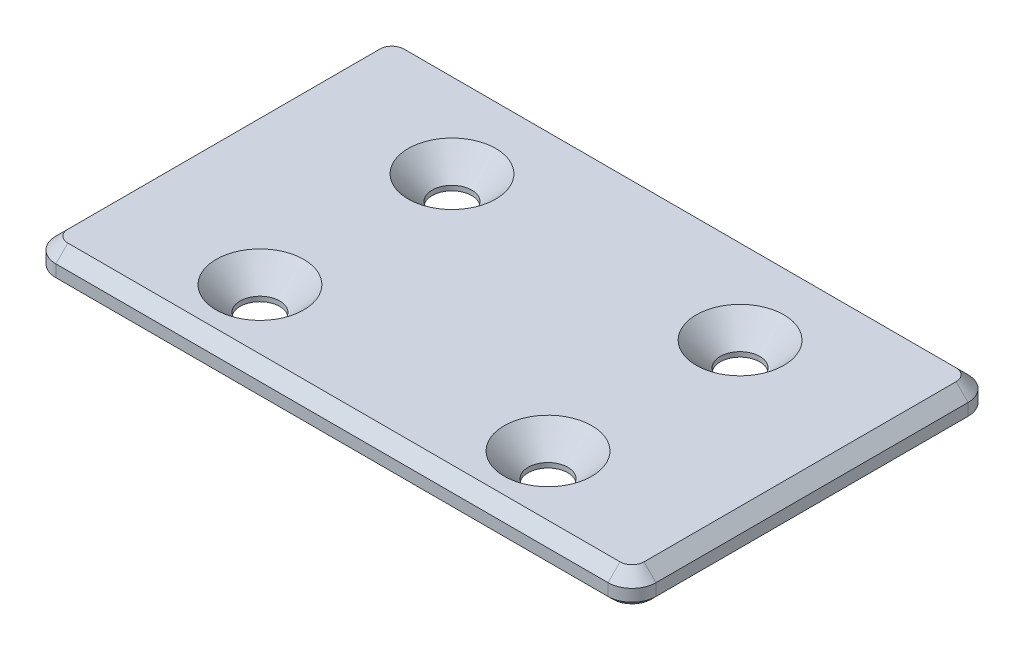
ISO-10303-21;
HEADER;
FILE_DESCRIPTION(('STEP AP214'),'2;1');
FILE_NAME('part.step','',(''),(''),'','','');
FILE_SCHEMA(('AUTOMOTIVE_DESIGN { 1 0 10303 214 1 1 1 1 }'));
ENDSEC;
DATA;
#1=APPLICATION_CONTEXT('core data for automotive mechanical design processes');
#2=APPLICATION_PROTOCOL_DEFINITION('international standard','automotive_design',2000,#1);
#3=PRODUCT_CONTEXT('',#1,'mechanical');
#4=PRODUCT('Part','Part','',(#3));
#5=PRODUCT_RELATED_PRODUCT_CATEGORY('part','',(#4));
#6=PRODUCT_DEFINITION_FORMATION('','',#4);
#7=PRODUCT_DEFINITION_CONTEXT('part definition',#1,'design');
#8=PRODUCT_DEFINITION('design','',#6,#7);
#9=PRODUCT_DEFINITION_SHAPE('','',#8);
#10=(LENGTH_UNIT() NAMED_UNIT(*) SI_UNIT(.MILLI.,.METRE.));
#11=(NAMED_UNIT(*) PLANE_ANGLE_UNIT() SI_UNIT($,.RADIAN.));
#12=(NAMED_UNIT(*) SI_UNIT($,.STERADIAN.) SOLID_ANGLE_UNIT());
#13=UNCERTAINTY_MEASURE_WITH_UNIT(LENGTH_MEASURE(1.E-05),#10,'distance_accuracy_value','');
#14=(GEOMETRIC_REPRESENTATION_CONTEXT(3) GLOBAL_UNCERTAINTY_ASSIGNED_CONTEXT((#13)) GLOBAL_UNIT_ASSIGNED_CONTEXT((#10,
#11,#12)) REPRESENTATION_CONTEXT('',''));
#15=CARTESIAN_POINT('',(0.,0.,0.));
#16=DIRECTION('',(0.,0.,1.));
#17=DIRECTION('',(1.,0.,0.));
#18=AXIS2_PLACEMENT_3D('',#15,#16,#17);
#19=CARTESIAN_POINT('',(0.,2.4,0.));
#20=DIRECTION('',(1.,0.,0.));
#21=DIRECTION('',(0.,0.,-1.));
#22=AXIS2_PLACEMENT_3D('',#19,#20,#21);
#23=PLANE('',#22);
#24=DIRECTION('',(0.,-1.,0.));
#25=VECTOR('',#24,1.);
#26=CARTESIAN_POINT('',(0.,2.4,-28.));
#27=LINE('',#26,#25);
#28=CARTESIAN_POINT('',(0.,1.4,-28.));
#29=VERTEX_POINT('',#28);
#30=CARTESIAN_POINT('',(0.,0.400000000000005,-28.));
#31=VERTEX_POINT('',#30);
#32=EDGE_CURVE('E308',#29,#31,#27,.T.);
#33=ORIENTED_EDGE('',*,*,#32,.T.);
#34=DIRECTION('',(0.,0.,1.));
#35=VECTOR('',#34,1.);
#36=CARTESIAN_POINT('',(0.,0.400000000000005,-2.));
#37=LINE('',#36,#35);
#38=CARTESIAN_POINT('',(0.,0.400000000000005,-2.));
#39=VERTEX_POINT('',#38);
#40=EDGE_CURVE('E221',#31,#39,#37,.T.);
#41=ORIENTED_EDGE('',*,*,#40,.T.);
#42=DIRECTION('',(0.,-1.,0.));
#43=VECTOR('',#42,1.);
#44=CARTESIAN_POINT('',(0.,2.4,-2.));
#45=LINE('',#44,#43);
#46=CARTESIAN_POINT('',(0.,1.4,-2.));
#47=VERTEX_POINT('',#46);
#48=EDGE_CURVE('E180',#39,#47,#45,.F.);
#49=ORIENTED_EDGE('',*,*,#48,.T.);
#50=DIRECTION('',(0.,0.,-1.));
#51=VECTOR('',#50,1.);
#52=CARTESIAN_POINT('',(0.,1.4,0.));
#53=LINE('',#52,#51);
#54=EDGE_CURVE('E276',#47,#29,#53,.T.);
#55=ORIENTED_EDGE('',*,*,#54,.T.);
#56=EDGE_LOOP('',(#33,#41,#49,#55));
#57=FACE_BOUND('',#56,.T.);
#58=ADVANCED_FACE('F41',(#57),#23,.F.);
#59=CARTESIAN_POINT('',(0.,2.4,0.));
#60=DIRECTION('',(0.,0.,-1.));
#61=DIRECTION('',(-1.,0.,0.));
#62=AXIS2_PLACEMENT_3D('',#59,#60,#61);
#63=PLANE('',#62);
#64=DIRECTION('',(0.,-1.,0.));
#65=VECTOR('',#64,1.);
#66=CARTESIAN_POINT('',(2.,2.4,0.));
#67=LINE('',#66,#65);
#68=CARTESIAN_POINT('',(2.,1.4,0.));
#69=VERTEX_POINT('',#68);
#70=CARTESIAN_POINT('',(2.,0.400000000000005,0.));
#71=VERTEX_POINT('',#70);
#72=EDGE_CURVE('E303',#69,#71,#67,.T.);
#73=ORIENTED_EDGE('',*,*,#72,.T.);
#74=DIRECTION('',(1.,0.,0.));
#75=VECTOR('',#74,1.);
#76=CARTESIAN_POINT('',(48.,0.400000000000005,0.));
#77=LINE('',#76,#75);
#78=CARTESIAN_POINT('',(48.,0.400000000000005,0.));
#79=VERTEX_POINT('',#78);
#80=EDGE_CURVE('E194',#71,#79,#77,.T.);
#81=ORIENTED_EDGE('',*,*,#80,.T.);
#82=DIRECTION('',(0.,-1.,0.));
#83=VECTOR('',#82,1.);
#84=CARTESIAN_POINT('',(48.,2.4,0.));
#85=LINE('',#84,#83);
#86=CARTESIAN_POINT('',(48.,1.4,0.));
#87=VERTEX_POINT('',#86);
#88=EDGE_CURVE('E306',#79,#87,#85,.F.);
#89=ORIENTED_EDGE('',*,*,#88,.T.);
#90=DIRECTION('',(-1.,0.,0.));
#91=VECTOR('',#90,1.);
#92=CARTESIAN_POINT('',(0.,1.4,0.));
#93=LINE('',#92,#91);
#94=EDGE_CURVE('E322',#87,#69,#93,.T.);
#95=ORIENTED_EDGE('',*,*,#94,.T.);
#96=EDGE_LOOP('',(#73,#81,#89,#95));
#97=FACE_BOUND('',#96,.T.);
#98=ADVANCED_FACE('F363',(#97),#63,.F.);
#99=CARTESIAN_POINT('',(50.,2.4,0.));
#100=DIRECTION('',(-1.,0.,0.));
#101=DIRECTION('',(0.,0.,1.));
#102=AXIS2_PLACEMENT_3D('',#99,#100,#101);
#103=PLANE('',#102);
#104=DIRECTION('',(0.,-1.,0.));
#105=VECTOR('',#104,1.);
#106=CARTESIAN_POINT('',(50.,2.4,-2.));
#107=LINE('',#106,#105);
#108=CARTESIAN_POINT('',(50.,1.4,-2.));
#109=VERTEX_POINT('',#108);
#110=CARTESIAN_POINT('',(50.,0.400000000000005,-2.));
#111=VERTEX_POINT('',#110);
#112=EDGE_CURVE('E294',#109,#111,#107,.T.);
#113=ORIENTED_EDGE('',*,*,#112,.T.);
#114=DIRECTION('',(0.,0.,-1.));
#115=VECTOR('',#114,1.);
#116=CARTESIAN_POINT('',(50.,0.400000000000005,-28.));
#117=LINE('',#116,#115);
#118=CARTESIAN_POINT('',(50.,0.400000000000005,-28.));
#119=VERTEX_POINT('',#118);
#120=EDGE_CURVE('E219',#111,#119,#117,.T.);
#121=ORIENTED_EDGE('',*,*,#120,.T.);
#122=DIRECTION('',(0.,-1.,0.));
#123=VECTOR('',#122,1.);
#124=CARTESIAN_POINT('',(50.,2.4,-28.));
#125=LINE('',#124,#123);
#126=CARTESIAN_POINT('',(50.,1.4,-28.));
#127=VERTEX_POINT('',#126);
#128=EDGE_CURVE('E296',#119,#127,#125,.F.);
#129=ORIENTED_EDGE('',*,*,#128,.T.);
#130=DIRECTION('',(0.,0.,1.));
#131=VECTOR('',#130,1.);
#132=CARTESIAN_POINT('',(50.,1.4,0.));
#133=LINE('',#132,#131);
#134=EDGE_CURVE('E271',#127,#109,#133,.T.);
#135=ORIENTED_EDGE('',*,*,#134,.T.);
#136=EDGE_LOOP('',(#113,#121,#129,#135));
#137=FACE_BOUND('',#136,.T.);
#138=ADVANCED_FACE('F369',(#137),#103,.F.);
#139=CARTESIAN_POINT('',(0.,2.4,-30.));
#140=DIRECTION('',(0.,0.,1.));
#141=DIRECTION('',(1.,0.,0.));
#142=AXIS2_PLACEMENT_3D('',#139,#140,#141);
#143=PLANE('',#142);
#144=DIRECTION('',(0.,-1.,0.));
#145=VECTOR('',#144,1.);
#146=CARTESIAN_POINT('',(48.,2.4,-30.));
#147=LINE('',#146,#145);
#148=CARTESIAN_POINT('',(48.,1.4,-30.));
#149=VERTEX_POINT('',#148);
#150=CARTESIAN_POINT('',(48.,0.400000000000005,-30.));
#151=VERTEX_POINT('',#150);
#152=EDGE_CURVE('E291',#149,#151,#147,.T.);
#153=ORIENTED_EDGE('',*,*,#152,.T.);
#154=DIRECTION('',(-1.,0.,0.));
#155=VECTOR('',#154,1.);
#156=CARTESIAN_POINT('',(2.,0.400000000000005,-30.));
#157=LINE('',#156,#155);
#158=CARTESIAN_POINT('',(2.,0.400000000000005,-30.));
#159=VERTEX_POINT('',#158);
#160=EDGE_CURVE('E11',#151,#159,#157,.T.);
#161=ORIENTED_EDGE('',*,*,#160,.T.);
#162=DIRECTION('',(0.,-1.,0.));
#163=VECTOR('',#162,1.);
#164=CARTESIAN_POINT('',(2.,2.4,-30.));
#165=LINE('',#164,#163);
#166=CARTESIAN_POINT('',(2.,1.4,-30.));
#167=VERTEX_POINT('',#166);
#168=EDGE_CURVE('E292',#159,#167,#165,.F.);
#169=ORIENTED_EDGE('',*,*,#168,.T.);
#170=DIRECTION('',(1.,0.,0.));
#171=VECTOR('',#170,1.);
#172=CARTESIAN_POINT('',(0.,1.4,-30.));
#173=LINE('',#172,#171);
#174=EDGE_CURVE('E198',#167,#149,#173,.T.);
#175=ORIENTED_EDGE('',*,*,#174,.T.);
#176=EDGE_LOOP('',(#153,#161,#169,#175));
#177=FACE_BOUND('',#176,.T.);
#178=ADVANCED_FACE('F290',(#177),#143,.F.);
#179=CARTESIAN_POINT('',(0.,2.4,0.));
#180=DIRECTION('',(0.,-1.,0.));
#181=DIRECTION('',(0.,0.,-1.));
#182=AXIS2_PLACEMENT_3D('',#179,#180,#181);
#183=PLANE('',#182);
#184=CARTESIAN_POINT('',(2.,2.4,-2.));
#185=DIRECTION('',(0.,-1.,0.));
#186=DIRECTION('',(0.,0.,-1.));
#187=AXIS2_PLACEMENT_3D('',#184,#185,#186);
#188=CIRCLE('',#187,0.999999999999999);
#189=CARTESIAN_POINT('',(1.,2.4,-2.));
#190=VERTEX_POINT('',#189);
#191=CARTESIAN_POINT('',(2.,2.4,-1.));
#192=VERTEX_POINT('',#191);
#193=EDGE_CURVE('E315',#190,#192,#188,.F.);
#194=ORIENTED_EDGE('',*,*,#193,.T.);
#195=DIRECTION('',(1.,0.,0.));
#196=VECTOR('',#195,1.);
#197=CARTESIAN_POINT('',(0.,2.4,-1.));
#198=LINE('',#197,#196);
#199=CARTESIAN_POINT('',(48.,2.4,-0.999999999999999));
#200=VERTEX_POINT('',#199);
#201=EDGE_CURVE('E319',#192,#200,#198,.T.);
#202=ORIENTED_EDGE('',*,*,#201,.T.);
#203=CARTESIAN_POINT('',(48.,2.4,-2.));
#204=DIRECTION('',(0.,-1.,0.));
#205=DIRECTION('',(0.,0.,-1.));
#206=AXIS2_PLACEMENT_3D('',#203,#204,#205);
#207=CIRCLE('',#206,1.);
#208=CARTESIAN_POINT('',(49.,2.4,-2.));
#209=VERTEX_POINT('',#208);
#210=EDGE_CURVE('E317',#200,#209,#207,.F.);
#211=ORIENTED_EDGE('',*,*,#210,.T.);
#212=DIRECTION('',(0.,0.,-1.));
#213=VECTOR('',#212,1.);
#214=CARTESIAN_POINT('',(49.,2.4,0.));
#215=LINE('',#214,#213);
#216=CARTESIAN_POINT('',(49.,2.4,-28.));
#217=VERTEX_POINT('',#216);
#218=EDGE_CURVE('E163',#209,#217,#215,.T.);
#219=ORIENTED_EDGE('',*,*,#218,.T.);
#220=CARTESIAN_POINT('',(48.,2.4,-28.));
#221=DIRECTION('',(0.,-1.,0.));
#222=DIRECTION('',(0.,0.,-1.));
#223=AXIS2_PLACEMENT_3D('',#220,#221,#222);
#224=CIRCLE('',#223,1.);
#225=CARTESIAN_POINT('',(48.,2.4,-29.));
#226=VERTEX_POINT('',#225);
#227=EDGE_CURVE('E156',#217,#226,#224,.F.);
#228=ORIENTED_EDGE('',*,*,#227,.T.);
#229=DIRECTION('',(-1.,0.,0.));
#230=VECTOR('',#229,1.);
#231=CARTESIAN_POINT('',(0.,2.4,-29.));
#232=LINE('',#231,#230);
#233=CARTESIAN_POINT('',(2.,2.4,-29.));
#234=VERTEX_POINT('',#233);
#235=EDGE_CURVE('E160',#226,#234,#232,.T.);
#236=ORIENTED_EDGE('',*,*,#235,.T.);
#237=CARTESIAN_POINT('',(2.,2.4,-28.));
#238=DIRECTION('',(0.,-1.,0.));
#239=DIRECTION('',(0.,0.,-1.));
#240=AXIS2_PLACEMENT_3D('',#237,#238,#239);
#241=CIRCLE('',#240,0.999999999999999);
#242=CARTESIAN_POINT('',(1.,2.4,-28.));
#243=VERTEX_POINT('',#242);
#244=EDGE_CURVE('E169',#234,#243,#241,.F.);
#245=ORIENTED_EDGE('',*,*,#244,.T.);
#246=DIRECTION('',(0.,0.,1.));
#247=VECTOR('',#246,1.);
#248=CARTESIAN_POINT('',(1.,2.4,0.));
#249=LINE('',#248,#247);
#250=EDGE_CURVE('E168',#243,#190,#249,.T.);
#251=ORIENTED_EDGE('',*,*,#250,.T.);
#252=EDGE_LOOP('',(#194,#202,#211,#219,#228,#236,#245,#251));
#253=FACE_BOUND('',#252,.T.);
#254=CARTESIAN_POINT('',(37.,2.4,-22.));
#255=DIRECTION('',(0.,-1.,0.));
#256=DIRECTION('',(0.,0.,-1.));
#257=AXIS2_PLACEMENT_3D('',#254,#255,#256);
#258=CIRCLE('',#257,3.65000000000002);
#259=CARTESIAN_POINT('',(37.,2.4,-25.65));
#260=VERTEX_POINT('',#259);
#261=EDGE_CURVE('E567',#260,#260,#258,.T.);
#262=ORIENTED_EDGE('',*,*,#261,.T.);
#263=EDGE_LOOP('',(#262));
#264=FACE_BOUND('',#263,.T.);
#265=CARTESIAN_POINT('',(12.9999999999999,2.4,-22.));
#266=DIRECTION('',(0.,-1.,0.));
#267=DIRECTION('',(0.,0.,-1.));
#268=AXIS2_PLACEMENT_3D('',#265,#266,#267);
#269=CIRCLE('',#268,3.65000000000002);
#270=CARTESIAN_POINT('',(12.9999999999999,2.4,-25.65));
#271=VERTEX_POINT('',#270);
#272=EDGE_CURVE('E564',#271,#271,#269,.T.);
#273=ORIENTED_EDGE('',*,*,#272,.T.);
#274=EDGE_LOOP('',(#273));
#275=FACE_BOUND('',#274,.T.);
#276=CARTESIAN_POINT('',(37.,2.4,-6.));
#277=DIRECTION('',(0.,-1.,0.));
#278=DIRECTION('',(0.,0.,-1.));
#279=AXIS2_PLACEMENT_3D('',#276,#277,#278);
#280=CIRCLE('',#279,3.65000000000002);
#281=CARTESIAN_POINT('',(37.,2.4,-9.65000000000002));
#282=VERTEX_POINT('',#281);
#283=EDGE_CURVE('E561',#282,#282,#280,.T.);
#284=ORIENTED_EDGE('',*,*,#283,.T.);
#285=EDGE_LOOP('',(#284));
#286=FACE_BOUND('',#285,.T.);
#287=CARTESIAN_POINT('',(13.,2.4,-6.));
#288=DIRECTION('',(0.,-1.,0.));
#289=DIRECTION('',(0.,0.,-1.));
#290=AXIS2_PLACEMENT_3D('',#287,#288,#289);
#291=CIRCLE('',#290,3.65000000000004);
#292=CARTESIAN_POINT('',(13.,2.4,-9.65000000000004));
#293=VERTEX_POINT('',#292);
#294=EDGE_CURVE('E558',#293,#293,#291,.T.);
#295=ORIENTED_EDGE('',*,*,#294,.T.);
#296=EDGE_LOOP('',(#295));
#297=FACE_BOUND('',#296,.T.);
#298=ADVANCED_FACE('F158',(#253,#264,#275,#286,#297),#183,.F.);
#299=CARTESIAN_POINT('',(0.,0.,0.));
#300=DIRECTION('',(0.,-1.,0.));
#301=DIRECTION('',(0.,0.,-1.));
#302=AXIS2_PLACEMENT_3D('',#299,#300,#301);
#303=PLANE('',#302);
#304=CARTESIAN_POINT('',(48.,0.,-2.));
#305=DIRECTION('',(0.,-1.,0.));
#306=DIRECTION('',(0.,0.,-1.));
#307=AXIS2_PLACEMENT_3D('',#304,#305,#306);
#308=CIRCLE('',#307,1.6);
#309=CARTESIAN_POINT('',(49.6,0.,-2.));
#310=VERTEX_POINT('',#309);
#311=CARTESIAN_POINT('',(48.,0.,-0.400000000000003));
#312=VERTEX_POINT('',#311);
#313=EDGE_CURVE('E210',#310,#312,#308,.T.);
#314=ORIENTED_EDGE('',*,*,#313,.T.);
#315=DIRECTION('',(-1.,0.,0.));
#316=VECTOR('',#315,1.);
#317=CARTESIAN_POINT('',(2.,0.,-0.400000000000005));
#318=LINE('',#317,#316);
#319=CARTESIAN_POINT('',(2.,0.,-0.400000000000005));
#320=VERTEX_POINT('',#319);
#321=EDGE_CURVE('E212',#312,#320,#318,.T.);
#322=ORIENTED_EDGE('',*,*,#321,.T.);
#323=CARTESIAN_POINT('',(2.,0.,-2.));
#324=DIRECTION('',(0.,-1.,0.));
#325=DIRECTION('',(0.,0.,-1.));
#326=AXIS2_PLACEMENT_3D('',#323,#324,#325);
#327=CIRCLE('',#326,1.6);
#328=CARTESIAN_POINT('',(0.400000000000005,0.,-2.));
#329=VERTEX_POINT('',#328);
#330=EDGE_CURVE('E208',#320,#329,#327,.T.);
#331=ORIENTED_EDGE('',*,*,#330,.T.);
#332=DIRECTION('',(0.,0.,-1.));
#333=VECTOR('',#332,1.);
#334=CARTESIAN_POINT('',(0.400000000000005,0.,-28.));
#335=LINE('',#334,#333);
#336=CARTESIAN_POINT('',(0.400000000000006,0.,-28.));
#337=VERTEX_POINT('',#336);
#338=EDGE_CURVE('E204',#329,#337,#335,.T.);
#339=ORIENTED_EDGE('',*,*,#338,.T.);
#340=CARTESIAN_POINT('',(2.,0.,-28.));
#341=DIRECTION('',(0.,-1.,0.));
#342=DIRECTION('',(0.,0.,-1.));
#343=AXIS2_PLACEMENT_3D('',#340,#341,#342);
#344=CIRCLE('',#343,1.59999999999999);
#345=CARTESIAN_POINT('',(2.,0.,-29.6));
#346=VERTEX_POINT('',#345);
#347=EDGE_CURVE('E200',#337,#346,#344,.T.);
#348=ORIENTED_EDGE('',*,*,#347,.T.);
#349=DIRECTION('',(1.,0.,0.));
#350=VECTOR('',#349,1.);
#351=CARTESIAN_POINT('',(48.,0.,-29.6));
#352=LINE('',#351,#350);
#353=CARTESIAN_POINT('',(48.,0.,-29.6));
#354=VERTEX_POINT('',#353);
#355=EDGE_CURVE('E197',#346,#354,#352,.T.);
#356=ORIENTED_EDGE('',*,*,#355,.T.);
#357=CARTESIAN_POINT('',(48.,0.,-28.));
#358=DIRECTION('',(0.,-1.,0.));
#359=DIRECTION('',(0.,0.,-1.));
#360=AXIS2_PLACEMENT_3D('',#357,#358,#359);
#361=CIRCLE('',#360,1.6);
#362=CARTESIAN_POINT('',(49.6,0.,-28.));
#363=VERTEX_POINT('',#362);
#364=EDGE_CURVE('E202',#354,#363,#361,.T.);
#365=ORIENTED_EDGE('',*,*,#364,.T.);
#366=DIRECTION('',(0.,0.,1.));
#367=VECTOR('',#366,1.);
#368=CARTESIAN_POINT('',(49.6,0.,-2.));
#369=LINE('',#368,#367);
#370=EDGE_CURVE('E206',#363,#310,#369,.T.);
#371=ORIENTED_EDGE('',*,*,#370,.T.);
#372=EDGE_LOOP('',(#314,#322,#331,#339,#348,#356,#365,#371));
#373=FACE_BOUND('',#372,.T.);
#374=CARTESIAN_POINT('',(13.,0.,-6.));
#375=DIRECTION('',(0.,1.,0.));
#376=DIRECTION('',(0.,0.,1.));
#377=AXIS2_PLACEMENT_3D('',#374,#375,#376);
#378=CIRCLE('',#377,1.65000000000002);
#379=CARTESIAN_POINT('',(13.,0.,-4.34999999999998));
#380=VERTEX_POINT('',#379);
#381=EDGE_CURVE('E547',#380,#380,#378,.T.);
#382=ORIENTED_EDGE('',*,*,#381,.T.);
#383=EDGE_LOOP('',(#382));
#384=FACE_BOUND('',#383,.T.);
#385=CARTESIAN_POINT('',(37.,0.,-22.));
#386=DIRECTION('',(0.,1.,0.));
#387=DIRECTION('',(0.,0.,1.));
#388=AXIS2_PLACEMENT_3D('',#385,#386,#387);
#389=CIRCLE('',#388,1.65);
#390=CARTESIAN_POINT('',(37.,0.,-20.35));
#391=VERTEX_POINT('',#390);
#392=EDGE_CURVE('E544',#391,#391,#389,.T.);
#393=ORIENTED_EDGE('',*,*,#392,.T.);
#394=EDGE_LOOP('',(#393));
#395=FACE_BOUND('',#394,.T.);
#396=CARTESIAN_POINT('',(37.,0.,-6.));
#397=DIRECTION('',(0.,1.,0.));
#398=DIRECTION('',(0.,0.,1.));
#399=AXIS2_PLACEMENT_3D('',#396,#397,#398);
#400=CIRCLE('',#399,1.65000000000002);
#401=CARTESIAN_POINT('',(37.,0.,-4.34999999999998));
#402=VERTEX_POINT('',#401);
#403=EDGE_CURVE('E187',#402,#402,#400,.T.);
#404=ORIENTED_EDGE('',*,*,#403,.T.);
#405=EDGE_LOOP('',(#404));
#406=FACE_BOUND('',#405,.T.);
#407=CARTESIAN_POINT('',(12.9999999999999,0.,-22.));
#408=DIRECTION('',(0.,1.,0.));
#409=DIRECTION('',(0.,0.,1.));
#410=AXIS2_PLACEMENT_3D('',#407,#408,#409);
#411=CIRCLE('',#410,1.65);
#412=CARTESIAN_POINT('',(12.9999999999999,0.,-20.35));
#413=VERTEX_POINT('',#412);
#414=EDGE_CURVE('E551',#413,#413,#411,.T.);
#415=ORIENTED_EDGE('',*,*,#414,.T.);
#416=EDGE_LOOP('',(#415));
#417=FACE_BOUND('',#416,.T.);
#418=ADVANCED_FACE('F497',(#373,#384,#395,#406,#417),#303,.T.);
#419=CARTESIAN_POINT('',(12.9999999999999,0.,-22.));
#420=DIRECTION('',(0.,1.,0.));
#421=DIRECTION('',(0.,0.,1.));
#422=AXIS2_PLACEMENT_3D('',#419,#420,#421);
#423=CYLINDRICAL_SURFACE('',#422,1.65);
#424=CARTESIAN_POINT('',(12.9999999999999,0.399999999999981,-22.));
#425=DIRECTION('',(0.,-1.,0.));
#426=DIRECTION('',(0.,0.,-1.));
#427=AXIS2_PLACEMENT_3D('',#424,#425,#426);
#428=CIRCLE('',#427,1.65);
#429=CARTESIAN_POINT('',(12.9999999999999,0.399999999999981,-23.65));
#430=VERTEX_POINT('',#429);
#431=EDGE_CURVE('E570',#430,#430,#428,.F.);
#432=ORIENTED_EDGE('',*,*,#431,.T.);
#433=EDGE_LOOP('',(#432));
#434=FACE_BOUND('',#433,.T.);
#435=ORIENTED_EDGE('',*,*,#414,.F.);
#436=EDGE_LOOP('',(#435));
#437=FACE_BOUND('',#436,.T.);
#438=ADVANCED_FACE('F519',(#434,#437),#423,.F.);
#439=CARTESIAN_POINT('',(37.,0.,-6.));
#440=DIRECTION('',(0.,1.,0.));
#441=DIRECTION('',(0.,0.,1.));
#442=AXIS2_PLACEMENT_3D('',#439,#440,#441);
#443=CYLINDRICAL_SURFACE('',#442,1.65000000000002);
#444=CARTESIAN_POINT('',(37.,0.400000000000003,-6.));
#445=DIRECTION('',(0.,-1.,0.));
#446=DIRECTION('',(0.,0.,-1.));
#447=AXIS2_PLACEMENT_3D('',#444,#445,#446);
#448=CIRCLE('',#447,1.65000000000002);
#449=CARTESIAN_POINT('',(37.,0.400000000000003,-7.65000000000003));
#450=VERTEX_POINT('',#449);
#451=EDGE_CURVE('E540',#450,#450,#448,.F.);
#452=ORIENTED_EDGE('',*,*,#451,.T.);
#453=EDGE_LOOP('',(#452));
#454=FACE_BOUND('',#453,.T.);
#455=ORIENTED_EDGE('',*,*,#403,.F.);
#456=EDGE_LOOP('',(#455));
#457=FACE_BOUND('',#456,.T.);
#458=ADVANCED_FACE('F524',(#454,#457),#443,.F.);
#459=CARTESIAN_POINT('',(37.,0.,-22.));
#460=DIRECTION('',(0.,1.,0.));
#461=DIRECTION('',(0.,0.,1.));
#462=AXIS2_PLACEMENT_3D('',#459,#460,#461);
#463=CYLINDRICAL_SURFACE('',#462,1.65);
#464=CARTESIAN_POINT('',(37.,0.399999999999982,-22.));
#465=DIRECTION('',(0.,-1.,0.));
#466=DIRECTION('',(0.,0.,-1.));
#467=AXIS2_PLACEMENT_3D('',#464,#465,#466);
#468=CIRCLE('',#467,1.65);
#469=CARTESIAN_POINT('',(37.,0.399999999999982,-23.65));
#470=VERTEX_POINT('',#469);
#471=EDGE_CURVE('E555',#470,#470,#468,.F.);
#472=ORIENTED_EDGE('',*,*,#471,.T.);
#473=EDGE_LOOP('',(#472));
#474=FACE_BOUND('',#473,.T.);
#475=ORIENTED_EDGE('',*,*,#392,.F.);
#476=EDGE_LOOP('',(#475));
#477=FACE_BOUND('',#476,.T.);
#478=ADVANCED_FACE('F526',(#474,#477),#463,.F.);
#479=CARTESIAN_POINT('',(13.,0.,-6.));
#480=DIRECTION('',(0.,1.,0.));
#481=DIRECTION('',(0.,0.,1.));
#482=AXIS2_PLACEMENT_3D('',#479,#480,#481);
#483=CYLINDRICAL_SURFACE('',#482,1.65000000000002);
#484=CARTESIAN_POINT('',(13.,0.39999999999998,-6.));
#485=DIRECTION('',(0.,-1.,0.));
#486=DIRECTION('',(0.,0.,-1.));
#487=AXIS2_PLACEMENT_3D('',#484,#485,#486);
#488=CIRCLE('',#487,1.65000000000002);
#489=CARTESIAN_POINT('',(13.,0.39999999999998,-7.65000000000002));
#490=VERTEX_POINT('',#489);
#491=EDGE_CURVE('E298',#490,#490,#488,.F.);
#492=ORIENTED_EDGE('',*,*,#491,.T.);
#493=EDGE_LOOP('',(#492));
#494=FACE_BOUND('',#493,.T.);
#495=ORIENTED_EDGE('',*,*,#381,.F.);
#496=EDGE_LOOP('',(#495));
#497=FACE_BOUND('',#496,.T.);
#498=ADVANCED_FACE('F381',(#494,#497),#483,.F.);
#499=CARTESIAN_POINT('',(37.,0.399999999999982,-22.));
#500=DIRECTION('',(0.,1.,0.));
#501=DIRECTION('',(0.,0.,1.));
#502=AXIS2_PLACEMENT_3D('',#499,#500,#501);
#503=CONICAL_SURFACE('',#502,1.65,0.785398163397449);
#504=ORIENTED_EDGE('',*,*,#261,.F.);
#505=EDGE_LOOP('',(#504));
#506=FACE_BOUND('',#505,.T.);
#507=ORIENTED_EDGE('',*,*,#471,.F.);
#508=EDGE_LOOP('',(#507));
#509=FACE_BOUND('',#508,.T.);
#510=ADVANCED_FACE('F374',(#506,#509),#503,.F.);
#511=CARTESIAN_POINT('',(12.9999999999999,0.399999999999981,-22.));
#512=DIRECTION('',(0.,1.,0.));
#513=DIRECTION('',(0.,0.,1.));
#514=AXIS2_PLACEMENT_3D('',#511,#512,#513);
#515=CONICAL_SURFACE('',#514,1.65,0.785398163397449);
#516=ORIENTED_EDGE('',*,*,#272,.F.);
#517=EDGE_LOOP('',(#516));
#518=FACE_BOUND('',#517,.T.);
#519=ORIENTED_EDGE('',*,*,#431,.F.);
#520=EDGE_LOOP('',(#519));
#521=FACE_BOUND('',#520,.T.);
#522=ADVANCED_FACE('F380',(#518,#521),#515,.F.);
#523=CARTESIAN_POINT('',(37.,0.400000000000003,-6.));
#524=DIRECTION('',(0.,1.,0.));
#525=DIRECTION('',(0.,0.,1.));
#526=AXIS2_PLACEMENT_3D('',#523,#524,#525);
#527=CONICAL_SURFACE('',#526,1.65000000000002,0.785398163397449);
#528=ORIENTED_EDGE('',*,*,#283,.F.);
#529=EDGE_LOOP('',(#528));
#530=FACE_BOUND('',#529,.T.);
#531=ORIENTED_EDGE('',*,*,#451,.F.);
#532=EDGE_LOOP('',(#531));
#533=FACE_BOUND('',#532,.T.);
#534=ADVANCED_FACE('F388',(#530,#533),#527,.F.);
#535=CARTESIAN_POINT('',(13.,0.39999999999998,-6.));
#536=DIRECTION('',(0.,1.,0.));
#537=DIRECTION('',(0.,0.,1.));
#538=AXIS2_PLACEMENT_3D('',#535,#536,#537);
#539=CONICAL_SURFACE('',#538,1.65000000000002,0.785398163397449);
#540=ORIENTED_EDGE('',*,*,#294,.F.);
#541=EDGE_LOOP('',(#540));
#542=FACE_BOUND('',#541,.T.);
#543=ORIENTED_EDGE('',*,*,#491,.F.);
#544=EDGE_LOOP('',(#543));
#545=FACE_BOUND('',#544,.T.);
#546=ADVANCED_FACE('F395',(#542,#545),#539,.F.);
#547=CARTESIAN_POINT('',(48.,2.4,-28.));
#548=DIRECTION('',(0.,-1.,0.));
#549=DIRECTION('',(0.,0.,-1.));
#550=AXIS2_PLACEMENT_3D('',#547,#548,#549);
#551=CYLINDRICAL_SURFACE('',#550,2.);
#552=ORIENTED_EDGE('',*,*,#128,.F.);
#553=CARTESIAN_POINT('',(48.,0.400000000000005,-28.));
#554=DIRECTION('',(0.,-1.,0.));
#555=DIRECTION('',(0.,0.,-1.));
#556=AXIS2_PLACEMENT_3D('',#553,#554,#555);
#557=CIRCLE('',#556,2.);
#558=EDGE_CURVE('E65',#119,#151,#557,.F.);
#559=ORIENTED_EDGE('',*,*,#558,.T.);
#560=ORIENTED_EDGE('',*,*,#152,.F.);
#561=CARTESIAN_POINT('',(48.,1.4,-28.));
#562=DIRECTION('',(0.,-1.,0.));
#563=DIRECTION('',(0.,0.,-1.));
#564=AXIS2_PLACEMENT_3D('',#561,#562,#563);
#565=CIRCLE('',#564,2.);
#566=EDGE_CURVE('E184',#149,#127,#565,.T.);
#567=ORIENTED_EDGE('',*,*,#566,.T.);
#568=EDGE_LOOP('',(#552,#559,#560,#567));
#569=FACE_BOUND('',#568,.T.);
#570=ADVANCED_FACE('F293',(#569),#551,.T.);
#571=CARTESIAN_POINT('',(48.,2.4,-2.));
#572=DIRECTION('',(0.,-1.,0.));
#573=DIRECTION('',(0.,0.,-1.));
#574=AXIS2_PLACEMENT_3D('',#571,#572,#573);
#575=CYLINDRICAL_SURFACE('',#574,2.);
#576=ORIENTED_EDGE('',*,*,#88,.F.);
#577=CARTESIAN_POINT('',(48.,0.400000000000005,-2.));
#578=DIRECTION('',(0.,-1.,0.));
#579=DIRECTION('',(0.,0.,-1.));
#580=AXIS2_PLACEMENT_3D('',#577,#578,#579);
#581=CIRCLE('',#580,2.);
#582=EDGE_CURVE('E215',#79,#111,#581,.F.);
#583=ORIENTED_EDGE('',*,*,#582,.T.);
#584=ORIENTED_EDGE('',*,*,#112,.F.);
#585=CARTESIAN_POINT('',(48.,1.4,-2.));
#586=DIRECTION('',(0.,-1.,0.));
#587=DIRECTION('',(0.,0.,-1.));
#588=AXIS2_PLACEMENT_3D('',#585,#586,#587);
#589=CIRCLE('',#588,2.);
#590=EDGE_CURVE('E281',#109,#87,#589,.T.);
#591=ORIENTED_EDGE('',*,*,#590,.T.);
#592=EDGE_LOOP('',(#576,#583,#584,#591));
#593=FACE_BOUND('',#592,.T.);
#594=ADVANCED_FACE('F327',(#593),#575,.T.);
#595=CARTESIAN_POINT('',(2.,2.4,-2.));
#596=DIRECTION('',(0.,-1.,0.));
#597=DIRECTION('',(0.,0.,-1.));
#598=AXIS2_PLACEMENT_3D('',#595,#596,#597);
#599=CYLINDRICAL_SURFACE('',#598,2.);
#600=ORIENTED_EDGE('',*,*,#48,.F.);
#601=CARTESIAN_POINT('',(2.,0.400000000000005,-2.));
#602=DIRECTION('',(0.,-1.,0.));
#603=DIRECTION('',(0.,0.,-1.));
#604=AXIS2_PLACEMENT_3D('',#601,#602,#603);
#605=CIRCLE('',#604,2.);
#606=EDGE_CURVE('E217',#39,#71,#605,.F.);
#607=ORIENTED_EDGE('',*,*,#606,.T.);
#608=ORIENTED_EDGE('',*,*,#72,.F.);
#609=CARTESIAN_POINT('',(2.,1.4,-2.));
#610=DIRECTION('',(0.,-1.,0.));
#611=DIRECTION('',(0.,0.,-1.));
#612=AXIS2_PLACEMENT_3D('',#609,#610,#611);
#613=CIRCLE('',#612,2.);
#614=EDGE_CURVE('E277',#69,#47,#613,.T.);
#615=ORIENTED_EDGE('',*,*,#614,.T.);
#616=EDGE_LOOP('',(#600,#607,#608,#615));
#617=FACE_BOUND('',#616,.T.);
#618=ADVANCED_FACE('F343',(#617),#599,.T.);
#619=CARTESIAN_POINT('',(2.,2.4,-28.));
#620=DIRECTION('',(0.,-1.,0.));
#621=DIRECTION('',(0.,0.,-1.));
#622=AXIS2_PLACEMENT_3D('',#619,#620,#621);
#623=CYLINDRICAL_SURFACE('',#622,2.);
#624=ORIENTED_EDGE('',*,*,#168,.F.);
#625=CARTESIAN_POINT('',(2.,0.400000000000005,-28.));
#626=DIRECTION('',(0.,-1.,0.));
#627=DIRECTION('',(0.,0.,-1.));
#628=AXIS2_PLACEMENT_3D('',#625,#626,#627);
#629=CIRCLE('',#628,2.);
#630=EDGE_CURVE('E51',#159,#31,#629,.F.);
#631=ORIENTED_EDGE('',*,*,#630,.T.);
#632=ORIENTED_EDGE('',*,*,#32,.F.);
#633=CARTESIAN_POINT('',(2.,1.4,-28.));
#634=DIRECTION('',(0.,-1.,0.));
#635=DIRECTION('',(0.,0.,-1.));
#636=AXIS2_PLACEMENT_3D('',#633,#634,#635);
#637=CIRCLE('',#636,2.);
#638=EDGE_CURVE('E285',#29,#167,#637,.T.);
#639=ORIENTED_EDGE('',*,*,#638,.T.);
#640=EDGE_LOOP('',(#624,#631,#632,#639));
#641=FACE_BOUND('',#640,.T.);
#642=ADVANCED_FACE('F350',(#641),#623,.T.);
#643=CARTESIAN_POINT('',(0.,2.4,-29.));
#644=DIRECTION('',(0.,-0.707106781186547,0.707106781186547));
#645=DIRECTION('',(-1.,0.,0.));
#646=AXIS2_PLACEMENT_3D('',#643,#644,#645);
#647=PLANE('',#646);
#648=DIRECTION('',(0.,0.707106781186547,0.707106781186547));
#649=VECTOR('',#648,1.);
#650=CARTESIAN_POINT('',(48.,1.4,-30.));
#651=LINE('',#650,#649);
#652=EDGE_CURVE('E175',#149,#226,#651,.T.);
#653=ORIENTED_EDGE('',*,*,#652,.F.);
#654=ORIENTED_EDGE('',*,*,#174,.F.);
#655=DIRECTION('',(0.,-0.707106781186547,-0.707106781186547));
#656=VECTOR('',#655,1.);
#657=CARTESIAN_POINT('',(2.,2.4,-29.));
#658=LINE('',#657,#656);
#659=EDGE_CURVE('E178',#234,#167,#658,.T.);
#660=ORIENTED_EDGE('',*,*,#659,.F.);
#661=ORIENTED_EDGE('',*,*,#235,.F.);
#662=EDGE_LOOP('',(#653,#654,#660,#661));
#663=FACE_BOUND('',#662,.T.);
#664=ADVANCED_FACE('F173',(#663),#647,.F.);
#665=CARTESIAN_POINT('',(2.,2.4,-28.));
#666=DIRECTION('',(0.,-1.,0.));
#667=DIRECTION('',(0.,0.,-1.));
#668=AXIS2_PLACEMENT_3D('',#665,#666,#667);
#669=CONICAL_SURFACE('',#668,0.999999999999999,0.785398163397448);
#670=ORIENTED_EDGE('',*,*,#659,.T.);
#671=ORIENTED_EDGE('',*,*,#638,.F.);
#672=DIRECTION('',(-0.707106781186547,-0.707106781186547,0.));
#673=VECTOR('',#672,1.);
#674=CARTESIAN_POINT('',(1.,2.4,-28.));
#675=LINE('',#674,#673);
#676=EDGE_CURVE('E185',#243,#29,#675,.T.);
#677=ORIENTED_EDGE('',*,*,#676,.F.);
#678=ORIENTED_EDGE('',*,*,#244,.F.);
#679=EDGE_LOOP('',(#670,#671,#677,#678));
#680=FACE_BOUND('',#679,.T.);
#681=ADVANCED_FACE('F352',(#680),#669,.T.);
#682=CARTESIAN_POINT('',(48.,2.4,-28.));
#683=DIRECTION('',(0.,-1.,0.));
#684=DIRECTION('',(0.,0.,-1.));
#685=AXIS2_PLACEMENT_3D('',#682,#683,#684);
#686=CONICAL_SURFACE('',#685,1.,0.785398163397447);
#687=ORIENTED_EDGE('',*,*,#652,.T.);
#688=ORIENTED_EDGE('',*,*,#227,.F.);
#689=DIRECTION('',(-0.707106781186547,0.707106781186547,0.));
#690=VECTOR('',#689,1.);
#691=CARTESIAN_POINT('',(50.,1.4,-28.));
#692=LINE('',#691,#690);
#693=EDGE_CURVE('E190',#127,#217,#692,.T.);
#694=ORIENTED_EDGE('',*,*,#693,.F.);
#695=ORIENTED_EDGE('',*,*,#566,.F.);
#696=EDGE_LOOP('',(#687,#688,#694,#695));
#697=FACE_BOUND('',#696,.T.);
#698=ADVANCED_FACE('F182',(#697),#686,.T.);
#699=CARTESIAN_POINT('',(1.,2.4,0.));
#700=DIRECTION('',(0.707106781186547,-0.707106781186547,0.));
#701=DIRECTION('',(0.,0.,1.));
#702=AXIS2_PLACEMENT_3D('',#699,#700,#701);
#703=PLANE('',#702);
#704=ORIENTED_EDGE('',*,*,#676,.T.);
#705=ORIENTED_EDGE('',*,*,#54,.F.);
#706=DIRECTION('',(-0.707106781186547,-0.707106781186547,0.));
#707=VECTOR('',#706,1.);
#708=CARTESIAN_POINT('',(1.,2.4,-2.));
#709=LINE('',#708,#707);
#710=EDGE_CURVE('E265',#190,#47,#709,.T.);
#711=ORIENTED_EDGE('',*,*,#710,.F.);
#712=ORIENTED_EDGE('',*,*,#250,.F.);
#713=EDGE_LOOP('',(#704,#705,#711,#712));
#714=FACE_BOUND('',#713,.T.);
#715=ADVANCED_FACE('F346',(#714),#703,.F.);
#716=CARTESIAN_POINT('',(49.,2.4,0.));
#717=DIRECTION('',(-0.707106781186547,-0.707106781186547,0.));
#718=DIRECTION('',(0.,0.,-1.));
#719=AXIS2_PLACEMENT_3D('',#716,#717,#718);
#720=PLANE('',#719);
#721=ORIENTED_EDGE('',*,*,#693,.T.);
#722=ORIENTED_EDGE('',*,*,#218,.F.);
#723=DIRECTION('',(-0.707106781186547,0.707106781186547,0.));
#724=VECTOR('',#723,1.);
#725=CARTESIAN_POINT('',(50.,1.4,-2.));
#726=LINE('',#725,#724);
#727=EDGE_CURVE('E258',#109,#209,#726,.T.);
#728=ORIENTED_EDGE('',*,*,#727,.F.);
#729=ORIENTED_EDGE('',*,*,#134,.F.);
#730=EDGE_LOOP('',(#721,#722,#728,#729));
#731=FACE_BOUND('',#730,.T.);
#732=ADVANCED_FACE('F269',(#731),#720,.F.);
#733=CARTESIAN_POINT('',(2.,2.4,-2.));
#734=DIRECTION('',(0.,-1.,0.));
#735=DIRECTION('',(0.,0.,-1.));
#736=AXIS2_PLACEMENT_3D('',#733,#734,#735);
#737=CONICAL_SURFACE('',#736,0.999999999999999,0.785398163397448);
#738=ORIENTED_EDGE('',*,*,#710,.T.);
#739=ORIENTED_EDGE('',*,*,#614,.F.);
#740=DIRECTION('',(0.,-0.707106781186547,0.707106781186547));
#741=VECTOR('',#740,1.);
#742=CARTESIAN_POINT('',(2.,2.4,-1.));
#743=LINE('',#742,#741);
#744=EDGE_CURVE('E251',#192,#69,#743,.T.);
#745=ORIENTED_EDGE('',*,*,#744,.F.);
#746=ORIENTED_EDGE('',*,*,#193,.F.);
#747=EDGE_LOOP('',(#738,#739,#745,#746));
#748=FACE_BOUND('',#747,.T.);
#749=ADVANCED_FACE('F339',(#748),#737,.T.);
#750=CARTESIAN_POINT('',(48.,2.4,-2.));
#751=DIRECTION('',(0.,-1.,0.));
#752=DIRECTION('',(0.,0.,-1.));
#753=AXIS2_PLACEMENT_3D('',#750,#751,#752);
#754=CONICAL_SURFACE('',#753,1.,0.785398163397447);
#755=ORIENTED_EDGE('',*,*,#727,.T.);
#756=ORIENTED_EDGE('',*,*,#210,.F.);
#757=DIRECTION('',(0.,0.707106781186548,-0.707106781186547));
#758=VECTOR('',#757,1.);
#759=CARTESIAN_POINT('',(48.,1.4,0.));
#760=LINE('',#759,#758);
#761=EDGE_CURVE('E246',#87,#200,#760,.T.);
#762=ORIENTED_EDGE('',*,*,#761,.F.);
#763=ORIENTED_EDGE('',*,*,#590,.F.);
#764=EDGE_LOOP('',(#755,#756,#762,#763));
#765=FACE_BOUND('',#764,.T.);
#766=ADVANCED_FACE('F334',(#765),#754,.T.);
#767=CARTESIAN_POINT('',(0.,2.4,-1.));
#768=DIRECTION('',(0.,-0.707106781186547,-0.707106781186547));
#769=DIRECTION('',(1.,0.,0.));
#770=AXIS2_PLACEMENT_3D('',#767,#768,#769);
#771=PLANE('',#770);
#772=ORIENTED_EDGE('',*,*,#744,.T.);
#773=ORIENTED_EDGE('',*,*,#94,.F.);
#774=ORIENTED_EDGE('',*,*,#761,.T.);
#775=ORIENTED_EDGE('',*,*,#201,.F.);
#776=EDGE_LOOP('',(#772,#773,#774,#775));
#777=FACE_BOUND('',#776,.T.);
#778=ADVANCED_FACE('F329',(#777),#771,.F.);
#779=CARTESIAN_POINT('',(0.,0.400000000000005,-30.));
#780=DIRECTION('',(0.,-0.707106781186547,-0.707106781186547));
#781=DIRECTION('',(1.,0.,0.));
#782=AXIS2_PLACEMENT_3D('',#779,#780,#781);
#783=PLANE('',#782);
#784=DIRECTION('',(0.,0.707106781186547,-0.707106781186547));
#785=VECTOR('',#784,1.);
#786=CARTESIAN_POINT('',(48.,0.,-29.6));
#787=LINE('',#786,#785);
#788=EDGE_CURVE('E240',#354,#151,#787,.T.);
#789=ORIENTED_EDGE('',*,*,#788,.F.);
#790=ORIENTED_EDGE('',*,*,#355,.F.);
#791=DIRECTION('',(0.,-0.707106781186547,0.707106781186547));
#792=VECTOR('',#791,1.);
#793=CARTESIAN_POINT('',(2.,0.400000000000005,-30.));
#794=LINE('',#793,#792);
#795=EDGE_CURVE('E46',#159,#346,#794,.T.);
#796=ORIENTED_EDGE('',*,*,#795,.F.);
#797=ORIENTED_EDGE('',*,*,#160,.F.);
#798=EDGE_LOOP('',(#789,#790,#796,#797));
#799=FACE_BOUND('',#798,.T.);
#800=ADVANCED_FACE('F44',(#799),#783,.T.);
#801=CARTESIAN_POINT('',(2.,0.,-28.));
#802=DIRECTION('',(0.,1.,0.));
#803=DIRECTION('',(0.,0.,1.));
#804=AXIS2_PLACEMENT_3D('',#801,#802,#803);
#805=CONICAL_SURFACE('',#804,1.6,0.785398163397448);
#806=ORIENTED_EDGE('',*,*,#795,.T.);
#807=ORIENTED_EDGE('',*,*,#347,.F.);
#808=DIRECTION('',(0.707106781186549,-0.707106781186546,0.));
#809=VECTOR('',#808,1.);
#810=CARTESIAN_POINT('',(0.,0.400000000000005,-28.));
#811=LINE('',#810,#809);
#812=EDGE_CURVE('E238',#31,#337,#811,.T.);
#813=ORIENTED_EDGE('',*,*,#812,.F.);
#814=ORIENTED_EDGE('',*,*,#630,.F.);
#815=EDGE_LOOP('',(#806,#807,#813,#814));
#816=FACE_BOUND('',#815,.T.);
#817=ADVANCED_FACE('F483',(#816),#805,.T.);
#818=CARTESIAN_POINT('',(48.,0.,-28.));
#819=DIRECTION('',(0.,1.,0.));
#820=DIRECTION('',(0.,0.,1.));
#821=AXIS2_PLACEMENT_3D('',#818,#819,#820);
#822=CONICAL_SURFACE('',#821,1.6,0.785398163397446);
#823=ORIENTED_EDGE('',*,*,#788,.T.);
#824=ORIENTED_EDGE('',*,*,#558,.F.);
#825=DIRECTION('',(0.707106781186547,0.707106781186548,0.));
#826=VECTOR('',#825,1.);
#827=CARTESIAN_POINT('',(49.6,0.,-28.));
#828=LINE('',#827,#826);
#829=EDGE_CURVE('E235',#363,#119,#828,.T.);
#830=ORIENTED_EDGE('',*,*,#829,.F.);
#831=ORIENTED_EDGE('',*,*,#364,.F.);
#832=EDGE_LOOP('',(#823,#824,#830,#831));
#833=FACE_BOUND('',#832,.T.);
#834=ADVANCED_FACE('F477',(#833),#822,.T.);
#835=CARTESIAN_POINT('',(0.,0.400000000000005,0.));
#836=DIRECTION('',(-0.707106781186547,-0.707106781186547,0.));
#837=DIRECTION('',(0.,0.,-1.));
#838=AXIS2_PLACEMENT_3D('',#835,#836,#837);
#839=PLANE('',#838);
#840=ORIENTED_EDGE('',*,*,#812,.T.);
#841=ORIENTED_EDGE('',*,*,#338,.F.);
#842=DIRECTION('',(0.707106781186547,-0.707106781186547,0.));
#843=VECTOR('',#842,1.);
#844=CARTESIAN_POINT('',(0.,0.400000000000005,-2.));
#845=LINE('',#844,#843);
#846=EDGE_CURVE('E232',#39,#329,#845,.T.);
#847=ORIENTED_EDGE('',*,*,#846,.F.);
#848=ORIENTED_EDGE('',*,*,#40,.F.);
#849=EDGE_LOOP('',(#840,#841,#847,#848));
#850=FACE_BOUND('',#849,.T.);
#851=ADVANCED_FACE('F470',(#850),#839,.T.);
#852=CARTESIAN_POINT('',(50.,0.400000000000005,0.));
#853=DIRECTION('',(0.707106781186547,-0.707106781186547,0.));
#854=DIRECTION('',(0.,0.,1.));
#855=AXIS2_PLACEMENT_3D('',#852,#853,#854);
#856=PLANE('',#855);
#857=ORIENTED_EDGE('',*,*,#829,.T.);
#858=ORIENTED_EDGE('',*,*,#120,.F.);
#859=DIRECTION('',(0.707106781186547,0.707106781186547,0.));
#860=VECTOR('',#859,1.);
#861=CARTESIAN_POINT('',(49.6,0.,-2.));
#862=LINE('',#861,#860);
#863=EDGE_CURVE('E229',#310,#111,#862,.T.);
#864=ORIENTED_EDGE('',*,*,#863,.F.);
#865=ORIENTED_EDGE('',*,*,#370,.F.);
#866=EDGE_LOOP('',(#857,#858,#864,#865));
#867=FACE_BOUND('',#866,.T.);
#868=ADVANCED_FACE('F463',(#867),#856,.T.);
#869=CARTESIAN_POINT('',(2.,0.,-2.));
#870=DIRECTION('',(0.,1.,0.));
#871=DIRECTION('',(0.,0.,1.));
#872=AXIS2_PLACEMENT_3D('',#869,#870,#871);
#873=CONICAL_SURFACE('',#872,1.6,0.785398163397448);
#874=ORIENTED_EDGE('',*,*,#846,.T.);
#875=ORIENTED_EDGE('',*,*,#330,.F.);
#876=DIRECTION('',(0.,-0.707106781186547,-0.707106781186547));
#877=VECTOR('',#876,1.);
#878=CARTESIAN_POINT('',(2.,0.400000000000005,0.));
#879=LINE('',#878,#877);
#880=EDGE_CURVE('E227',#71,#320,#879,.T.);
#881=ORIENTED_EDGE('',*,*,#880,.F.);
#882=ORIENTED_EDGE('',*,*,#606,.F.);
#883=EDGE_LOOP('',(#874,#875,#881,#882));
#884=FACE_BOUND('',#883,.T.);
#885=ADVANCED_FACE('F456',(#884),#873,.T.);
#886=CARTESIAN_POINT('',(48.,0.,-2.));
#887=DIRECTION('',(0.,1.,0.));
#888=DIRECTION('',(0.,0.,1.));
#889=AXIS2_PLACEMENT_3D('',#886,#887,#888);
#890=CONICAL_SURFACE('',#889,1.6,0.785398163397446);
#891=ORIENTED_EDGE('',*,*,#863,.T.);
#892=ORIENTED_EDGE('',*,*,#582,.F.);
#893=DIRECTION('',(0.,0.707106781186549,0.707106781186546));
#894=VECTOR('',#893,1.);
#895=CARTESIAN_POINT('',(48.,0.,-0.400000000000003));
#896=LINE('',#895,#894);
#897=EDGE_CURVE('E225',#312,#79,#896,.T.);
#898=ORIENTED_EDGE('',*,*,#897,.F.);
#899=ORIENTED_EDGE('',*,*,#313,.F.);
#900=EDGE_LOOP('',(#891,#892,#898,#899));
#901=FACE_BOUND('',#900,.T.);
#902=ADVANCED_FACE('F449',(#901),#890,.T.);
#903=CARTESIAN_POINT('',(0.,0.400000000000005,0.));
#904=DIRECTION('',(0.,-0.707106781186547,0.707106781186547));
#905=DIRECTION('',(-1.,0.,0.));
#906=AXIS2_PLACEMENT_3D('',#903,#904,#905);
#907=PLANE('',#906);
#908=ORIENTED_EDGE('',*,*,#880,.T.);
#909=ORIENTED_EDGE('',*,*,#321,.F.);
#910=ORIENTED_EDGE('',*,*,#897,.T.);
#911=ORIENTED_EDGE('',*,*,#80,.F.);
#912=EDGE_LOOP('',(#908,#909,#910,#911));
#913=FACE_BOUND('',#912,.T.);
#914=ADVANCED_FACE('F443',(#913),#907,.T.);
#915=CLOSED_SHELL('',(#58,#98,#138,#178,#298,#418,#438,#458,#478,#498,#510,#522,#534,#546,#570,
#594,#618,#642,#664,#681,#698,#715,#732,#749,#766,#778,#800,#817,#834,#851,#868,#885,#902,#914));
#916=MANIFOLD_SOLID_BREP('B2',#915);
#917=ADVANCED_BREP_SHAPE_REPRESENTATION('',(#18,#916),#14);
#918=SHAPE_DEFINITION_REPRESENTATION(#9,#917);
ENDSEC;
END-ISO-10303-21;
